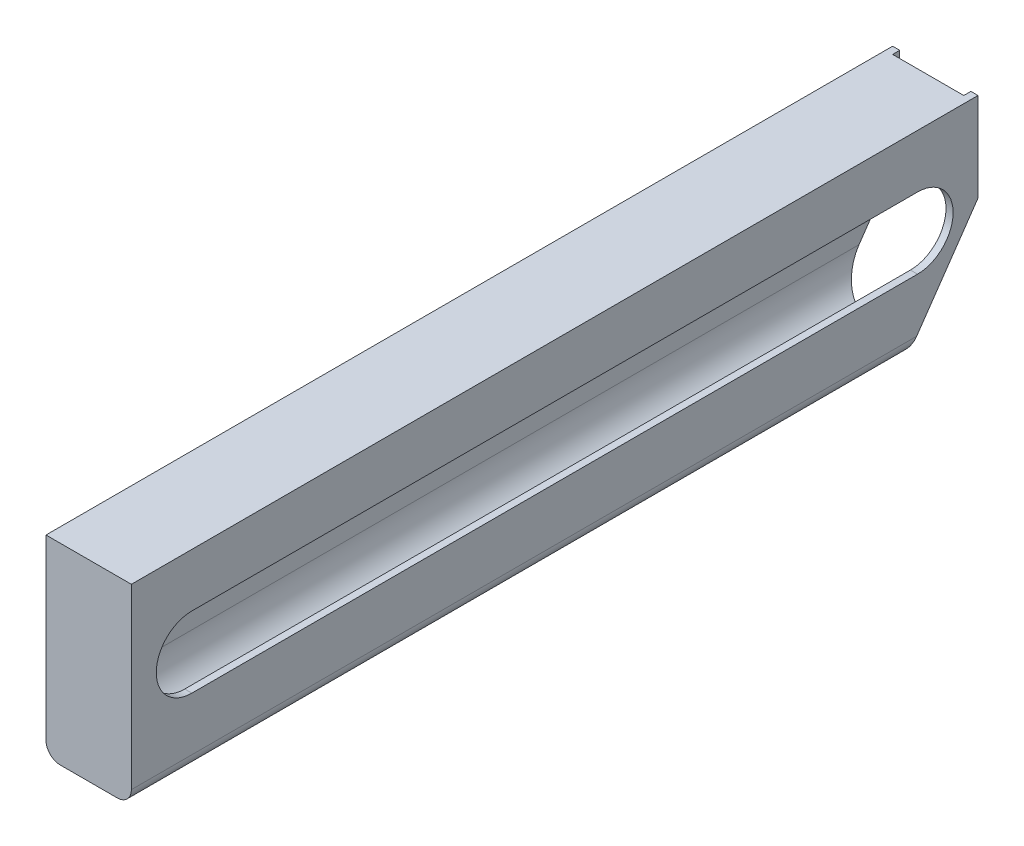
ISO-10303-21;
HEADER;
FILE_DESCRIPTION(('STEP AP214'),'2;1');
FILE_NAME('part.step','',(''),(''),'','','');
FILE_SCHEMA(('AUTOMOTIVE_DESIGN { 1 0 10303 214 1 1 1 1 }'));
ENDSEC;
DATA;
#1=APPLICATION_CONTEXT('core data for automotive mechanical design processes');
#2=APPLICATION_PROTOCOL_DEFINITION('international standard','automotive_design',2000,#1);
#3=PRODUCT_CONTEXT('',#1,'mechanical');
#4=PRODUCT('Part','Part','',(#3));
#5=PRODUCT_RELATED_PRODUCT_CATEGORY('part','',(#4));
#6=PRODUCT_DEFINITION_FORMATION('','',#4);
#7=PRODUCT_DEFINITION_CONTEXT('part definition',#1,'design');
#8=PRODUCT_DEFINITION('design','',#6,#7);
#9=PRODUCT_DEFINITION_SHAPE('','',#8);
#10=(LENGTH_UNIT() NAMED_UNIT(*) SI_UNIT(.MILLI.,.METRE.));
#11=(NAMED_UNIT(*) PLANE_ANGLE_UNIT() SI_UNIT($,.RADIAN.));
#12=(NAMED_UNIT(*) SI_UNIT($,.STERADIAN.) SOLID_ANGLE_UNIT());
#13=UNCERTAINTY_MEASURE_WITH_UNIT(LENGTH_MEASURE(1.E-05),#10,'distance_accuracy_value','');
#14=(GEOMETRIC_REPRESENTATION_CONTEXT(3) GLOBAL_UNCERTAINTY_ASSIGNED_CONTEXT((#13)) GLOBAL_UNIT_ASSIGNED_CONTEXT((#10,
#11,#12)) REPRESENTATION_CONTEXT('',''));
#15=CARTESIAN_POINT('',(0.,0.,0.));
#16=DIRECTION('',(0.,0.,1.));
#17=DIRECTION('',(1.,0.,0.));
#18=AXIS2_PLACEMENT_3D('',#15,#16,#17);
#19=CARTESIAN_POINT('',(6.4853819046404E-12,-8.3,117.));
#20=DIRECTION('',(0.,0.,-1.));
#21=DIRECTION('',(-1.,0.,0.));
#22=AXIS2_PLACEMENT_3D('',#19,#20,#21);
#23=PLANE('',#22);
#24=DIRECTION('',(0.,1.,0.));
#25=VECTOR('',#24,1.);
#26=CARTESIAN_POINT('',(-4.99999999999351,-8.3,117.));
#27=LINE('',#26,#25);
#28=CARTESIAN_POINT('',(-4.99999999999351,-8.3,117.));
#29=VERTEX_POINT('',#28);
#30=CARTESIAN_POINT('',(-4.99999999999351,11.5,117.));
#31=VERTEX_POINT('',#30);
#32=EDGE_CURVE('E318',#29,#31,#27,.T.);
#33=ORIENTED_EDGE('',*,*,#32,.T.);
#34=DIRECTION('',(1.,0.,0.));
#35=VECTOR('',#34,1.);
#36=CARTESIAN_POINT('',(5.00000000000649,11.5,117.));
#37=LINE('',#36,#35);
#38=CARTESIAN_POINT('',(5.00000000000649,11.5,117.));
#39=VERTEX_POINT('',#38);
#40=EDGE_CURVE('E321',#31,#39,#37,.T.);
#41=ORIENTED_EDGE('',*,*,#40,.T.);
#42=DIRECTION('',(0.,-1.,0.));
#43=VECTOR('',#42,1.);
#44=CARTESIAN_POINT('',(5.00000000000649,-8.3,117.));
#45=LINE('',#44,#43);
#46=CARTESIAN_POINT('',(5.00000000000649,-8.3,117.));
#47=VERTEX_POINT('',#46);
#48=EDGE_CURVE('E325',#39,#47,#45,.T.);
#49=ORIENTED_EDGE('',*,*,#48,.T.);
#50=CARTESIAN_POINT('',(6.4853819046404E-12,-8.3,117.));
#51=DIRECTION('',(0.,0.,-1.));
#52=DIRECTION('',(-1.,0.,0.));
#53=AXIS2_PLACEMENT_3D('',#50,#51,#52);
#54=CIRCLE('',#53,5.);
#55=EDGE_CURVE('E328',#47,#29,#54,.T.);
#56=ORIENTED_EDGE('',*,*,#55,.T.);
#57=EDGE_LOOP('',(#33,#41,#49,#56));
#58=FACE_BOUND('',#57,.T.);
#59=DIRECTION('',(1.,0.,0.));
#60=VECTOR('',#59,1.);
#61=CARTESIAN_POINT('',(3.,-9.75,117.));
#62=LINE('',#61,#60);
#63=CARTESIAN_POINT('',(-3.,-9.75,117.));
#64=VERTEX_POINT('',#63);
#65=CARTESIAN_POINT('',(3.,-9.75,117.));
#66=VERTEX_POINT('',#65);
#67=EDGE_CURVE('E572',#64,#66,#62,.T.);
#68=ORIENTED_EDGE('',*,*,#67,.F.);
#69=DIRECTION('',(0.,1.,0.));
#70=VECTOR('',#69,1.);
#71=CARTESIAN_POINT('',(-3.,-9.75,117.));
#72=LINE('',#71,#70);
#73=CARTESIAN_POINT('',(-3.,-12.25,117.));
#74=VERTEX_POINT('',#73);
#75=EDGE_CURVE('E227',#74,#64,#72,.T.);
#76=ORIENTED_EDGE('',*,*,#75,.F.);
#77=DIRECTION('',(-1.,0.,0.));
#78=VECTOR('',#77,1.);
#79=CARTESIAN_POINT('',(3.,-12.25,117.));
#80=LINE('',#79,#78);
#81=CARTESIAN_POINT('',(3.,-12.25,117.));
#82=VERTEX_POINT('',#81);
#83=EDGE_CURVE('E223',#82,#74,#80,.T.);
#84=ORIENTED_EDGE('',*,*,#83,.F.);
#85=DIRECTION('',(0.,-1.,0.));
#86=VECTOR('',#85,1.);
#87=CARTESIAN_POINT('',(3.,-9.75,117.));
#88=LINE('',#87,#86);
#89=EDGE_CURVE('E574',#66,#82,#88,.T.);
#90=ORIENTED_EDGE('',*,*,#89,.F.);
#91=EDGE_LOOP('',(#68,#76,#84,#90));
#92=FACE_BOUND('',#91,.T.);
#93=ADVANCED_FACE('F32',(#58,#92),#23,.T.);
#94=CARTESIAN_POINT('',(4.,-12.5,0.));
#95=DIRECTION('',(0.,0.,-1.));
#96=DIRECTION('',(-1.,0.,0.));
#97=AXIS2_PLACEMENT_3D('',#94,#95,#96);
#98=PLANE('',#97);
#99=DIRECTION('',(1.,0.,0.));
#100=VECTOR('',#99,1.);
#101=CARTESIAN_POINT('',(-6.,0.,0.));
#102=LINE('',#101,#100);
#103=CARTESIAN_POINT('',(5.00000000000649,0.,0.));
#104=VERTEX_POINT('',#103);
#105=CARTESIAN_POINT('',(6.,0.,0.));
#106=VERTEX_POINT('',#105);
#107=EDGE_CURVE('E238',#104,#106,#102,.T.);
#108=ORIENTED_EDGE('',*,*,#107,.F.);
#109=DIRECTION('',(0.,-1.,0.));
#110=VECTOR('',#109,1.);
#111=CARTESIAN_POINT('',(5.00000000000649,-8.3,0.));
#112=LINE('',#111,#110);
#113=CARTESIAN_POINT('',(5.,12.5,0.));
#114=VERTEX_POINT('',#113);
#115=EDGE_CURVE('E322',#114,#104,#112,.T.);
#116=ORIENTED_EDGE('',*,*,#115,.F.);
#117=DIRECTION('',(-1.,0.,0.));
#118=VECTOR('',#117,1.);
#119=CARTESIAN_POINT('',(-6.,12.5,0.));
#120=LINE('',#119,#118);
#121=CARTESIAN_POINT('',(6.,12.5,0.));
#122=VERTEX_POINT('',#121);
#123=EDGE_CURVE('E364',#122,#114,#120,.T.);
#124=ORIENTED_EDGE('',*,*,#123,.F.);
#125=DIRECTION('',(0.,1.,0.));
#126=VECTOR('',#125,1.);
#127=CARTESIAN_POINT('',(6.,12.5,0.));
#128=LINE('',#127,#126);
#129=EDGE_CURVE('E338',#106,#122,#128,.T.);
#130=ORIENTED_EDGE('',*,*,#129,.F.);
#131=EDGE_LOOP('',(#108,#116,#124,#130));
#132=FACE_BOUND('',#131,.T.);
#133=ADVANCED_FACE('F421',(#132),#98,.T.);
#134=CARTESIAN_POINT('',(6.,12.5,119.));
#135=DIRECTION('',(-1.,0.,0.));
#136=DIRECTION('',(0.,-1.,0.));
#137=AXIS2_PLACEMENT_3D('',#134,#135,#136);
#138=PLANE('',#137);
#139=DIRECTION('',(0.,0.,-1.));
#140=VECTOR('',#139,1.);
#141=CARTESIAN_POINT('',(6.,-4.99999999999881,8.49999783422666));
#142=LINE('',#141,#140);
#143=CARTESIAN_POINT('',(6.,-4.99999999999881,110.499997834188));
#144=VERTEX_POINT('',#143);
#145=CARTESIAN_POINT('',(6.,-4.99999999999881,8.49999783422666));
#146=VERTEX_POINT('',#145);
#147=EDGE_CURVE('E283',#144,#146,#142,.T.);
#148=ORIENTED_EDGE('',*,*,#147,.F.);
#149=CARTESIAN_POINT('',(6.,-2.17742490704609E-13,110.500002165792));
#150=DIRECTION('',(1.,0.,0.));
#151=DIRECTION('',(0.,0.,-1.));
#152=AXIS2_PLACEMENT_3D('',#149,#150,#151);
#153=CIRCLE('',#152,5.00000000000047);
#154=CARTESIAN_POINT('',(6.,5.00000000000025,110.500002165792));
#155=VERTEX_POINT('',#154);
#156=EDGE_CURVE('E266',#155,#144,#153,.T.);
#157=ORIENTED_EDGE('',*,*,#156,.F.);
#158=DIRECTION('',(0.,0.,1.));
#159=VECTOR('',#158,1.);
#160=CARTESIAN_POINT('',(6.,5.00000000000025,8.50000216579248));
#161=LINE('',#160,#159);
#162=CARTESIAN_POINT('',(6.,5.00000000000025,8.50000216579248));
#163=VERTEX_POINT('',#162);
#164=EDGE_CURVE('E272',#163,#155,#161,.T.);
#165=ORIENTED_EDGE('',*,*,#164,.F.);
#166=CARTESIAN_POINT('',(6.,-2.17742490704609E-13,8.50000216579248));
#167=DIRECTION('',(1.,0.,0.));
#168=DIRECTION('',(0.,0.,-1.));
#169=AXIS2_PLACEMENT_3D('',#166,#167,#168);
#170=CIRCLE('',#169,5.00000000000047);
#171=EDGE_CURVE('E286',#146,#163,#170,.T.);
#172=ORIENTED_EDGE('',*,*,#171,.F.);
#173=EDGE_LOOP('',(#148,#157,#165,#172));
#174=FACE_BOUND('',#173,.T.);
#175=DIRECTION('',(0.,0.,-1.));
#176=VECTOR('',#175,1.);
#177=CARTESIAN_POINT('',(6.,-12.5,119.));
#178=LINE('',#177,#176);
#179=CARTESIAN_POINT('',(6.,-12.5,119.));
#180=VERTEX_POINT('',#179);
#181=CARTESIAN_POINT('',(6.,-12.5,8.62068965517241));
#182=VERTEX_POINT('',#181);
#183=EDGE_CURVE('E361',#180,#182,#178,.T.);
#184=ORIENTED_EDGE('',*,*,#183,.T.);
#185=DIRECTION('',(0.,-0.823212785915306,0.56773295580366));
#186=VECTOR('',#185,1.);
#187=CARTESIAN_POINT('',(6.,0.,0.));
#188=LINE('',#187,#186);
#189=EDGE_CURVE('E229',#106,#182,#188,.T.);
#190=ORIENTED_EDGE('',*,*,#189,.F.);
#191=ORIENTED_EDGE('',*,*,#129,.T.);
#192=DIRECTION('',(0.,0.,-1.));
#193=VECTOR('',#192,1.);
#194=CARTESIAN_POINT('',(6.,12.5,119.));
#195=LINE('',#194,#193);
#196=CARTESIAN_POINT('',(6.,12.5,119.));
#197=VERTEX_POINT('',#196);
#198=EDGE_CURVE('E383',#197,#122,#195,.T.);
#199=ORIENTED_EDGE('',*,*,#198,.F.);
#200=DIRECTION('',(0.,1.,0.));
#201=VECTOR('',#200,1.);
#202=CARTESIAN_POINT('',(6.,12.5,119.));
#203=LINE('',#202,#201);
#204=EDGE_CURVE('E347',#180,#197,#203,.T.);
#205=ORIENTED_EDGE('',*,*,#204,.F.);
#206=EDGE_LOOP('',(#184,#190,#191,#199,#205));
#207=FACE_BOUND('',#206,.T.);
#208=ADVANCED_FACE('F34',(#174,#207),#138,.F.);
#209=CARTESIAN_POINT('',(-6.,12.5,119.));
#210=DIRECTION('',(0.,-1.,0.));
#211=DIRECTION('',(1.,0.,0.));
#212=AXIS2_PLACEMENT_3D('',#209,#210,#211);
#213=PLANE('',#212);
#214=ORIENTED_EDGE('',*,*,#123,.T.);
#215=DIRECTION('',(0.,0.,-1.));
#216=VECTOR('',#215,1.);
#217=CARTESIAN_POINT('',(5.,12.5,-1.));
#218=LINE('',#217,#216);
#219=CARTESIAN_POINT('',(5.,12.5,1.));
#220=VERTEX_POINT('',#219);
#221=EDGE_CURVE('E254',#220,#114,#218,.T.);
#222=ORIENTED_EDGE('',*,*,#221,.F.);
#223=DIRECTION('',(1.,0.,0.));
#224=VECTOR('',#223,1.);
#225=CARTESIAN_POINT('',(-5.,12.5,1.));
#226=LINE('',#225,#224);
#227=CARTESIAN_POINT('',(-5.,12.5,1.));
#228=VERTEX_POINT('',#227);
#229=EDGE_CURVE('E260',#228,#220,#226,.T.);
#230=ORIENTED_EDGE('',*,*,#229,.F.);
#231=DIRECTION('',(0.,0.,1.));
#232=VECTOR('',#231,1.);
#233=CARTESIAN_POINT('',(-5.,12.5,-1.));
#234=LINE('',#233,#232);
#235=CARTESIAN_POINT('',(-5.,12.5,0.));
#236=VERTEX_POINT('',#235);
#237=EDGE_CURVE('E257',#236,#228,#234,.T.);
#238=ORIENTED_EDGE('',*,*,#237,.F.);
#239=CARTESIAN_POINT('',(-6.,12.5,0.));
#240=VERTEX_POINT('',#239);
#241=EDGE_CURVE('E363',#236,#240,#120,.T.);
#242=ORIENTED_EDGE('',*,*,#241,.T.);
#243=DIRECTION('',(0.,0.,-1.));
#244=VECTOR('',#243,1.);
#245=CARTESIAN_POINT('',(-6.,12.5,119.));
#246=LINE('',#245,#244);
#247=CARTESIAN_POINT('',(-6.,12.5,119.));
#248=VERTEX_POINT('',#247);
#249=EDGE_CURVE('E380',#248,#240,#246,.T.);
#250=ORIENTED_EDGE('',*,*,#249,.F.);
#251=DIRECTION('',(-1.,0.,0.));
#252=VECTOR('',#251,1.);
#253=CARTESIAN_POINT('',(-6.,12.5,119.));
#254=LINE('',#253,#252);
#255=EDGE_CURVE('E350',#197,#248,#254,.T.);
#256=ORIENTED_EDGE('',*,*,#255,.F.);
#257=ORIENTED_EDGE('',*,*,#198,.T.);
#258=EDGE_LOOP('',(#214,#222,#230,#238,#242,#250,#256,#257));
#259=FACE_BOUND('',#258,.T.);
#260=ADVANCED_FACE('F417',(#259),#213,.F.);
#261=CARTESIAN_POINT('',(-6.,-12.5,119.));
#262=DIRECTION('',(1.,0.,0.));
#263=DIRECTION('',(0.,0.,-1.));
#264=AXIS2_PLACEMENT_3D('',#261,#262,#263);
#265=PLANE('',#264);
#266=DIRECTION('',(0.,0.,1.));
#267=VECTOR('',#266,1.);
#268=CARTESIAN_POINT('',(-6.,5.00000000000025,8.50000216579248));
#269=LINE('',#268,#267);
#270=CARTESIAN_POINT('',(-6.,5.00000000000025,8.50000216579248));
#271=VERTEX_POINT('',#270);
#272=CARTESIAN_POINT('',(-6.,5.00000000000025,110.500002165792));
#273=VERTEX_POINT('',#272);
#274=EDGE_CURVE('E278',#271,#273,#269,.T.);
#275=ORIENTED_EDGE('',*,*,#274,.T.);
#276=CARTESIAN_POINT('',(-6.,-2.17742490704609E-13,110.500002165792));
#277=DIRECTION('',(1.,0.,0.));
#278=DIRECTION('',(0.,0.,-1.));
#279=AXIS2_PLACEMENT_3D('',#276,#277,#278);
#280=CIRCLE('',#279,5.00000000000047);
#281=CARTESIAN_POINT('',(-6.,-4.99999999999881,110.499997834188));
#282=VERTEX_POINT('',#281);
#283=EDGE_CURVE('E268',#273,#282,#280,.T.);
#284=ORIENTED_EDGE('',*,*,#283,.T.);
#285=DIRECTION('',(0.,0.,-1.));
#286=VECTOR('',#285,1.);
#287=CARTESIAN_POINT('',(-6.,-4.99999999999881,8.49999783422666));
#288=LINE('',#287,#286);
#289=CARTESIAN_POINT('',(-6.,-4.99999999999881,8.49999783422667));
#290=VERTEX_POINT('',#289);
#291=EDGE_CURVE('E271',#282,#290,#288,.T.);
#292=ORIENTED_EDGE('',*,*,#291,.T.);
#293=CARTESIAN_POINT('',(-6.,-2.17742490704609E-13,8.50000216579248));
#294=DIRECTION('',(1.,0.,0.));
#295=DIRECTION('',(0.,0.,-1.));
#296=AXIS2_PLACEMENT_3D('',#293,#294,#295);
#297=CIRCLE('',#296,5.00000000000047);
#298=EDGE_CURVE('E275',#290,#271,#297,.T.);
#299=ORIENTED_EDGE('',*,*,#298,.T.);
#300=EDGE_LOOP('',(#275,#284,#292,#299));
#301=FACE_BOUND('',#300,.T.);
#302=DIRECTION('',(0.,-1.,0.));
#303=VECTOR('',#302,1.);
#304=CARTESIAN_POINT('',(-6.,-12.5,0.));
#305=LINE('',#304,#303);
#306=CARTESIAN_POINT('',(-6.,0.,0.));
#307=VERTEX_POINT('',#306);
#308=EDGE_CURVE('E351',#240,#307,#305,.T.);
#309=ORIENTED_EDGE('',*,*,#308,.T.);
#310=DIRECTION('',(0.,-0.823212785915306,0.56773295580366));
#311=VECTOR('',#310,1.);
#312=CARTESIAN_POINT('',(-6.,0.,0.));
#313=LINE('',#312,#311);
#314=CARTESIAN_POINT('',(-6.,-12.5,8.62068965517241));
#315=VERTEX_POINT('',#314);
#316=EDGE_CURVE('E231',#307,#315,#313,.T.);
#317=ORIENTED_EDGE('',*,*,#316,.T.);
#318=DIRECTION('',(0.,0.,-1.));
#319=VECTOR('',#318,1.);
#320=CARTESIAN_POINT('',(-6.,-12.5,119.));
#321=LINE('',#320,#319);
#322=CARTESIAN_POINT('',(-6.,-12.5,119.));
#323=VERTEX_POINT('',#322);
#324=EDGE_CURVE('E377',#323,#315,#321,.T.);
#325=ORIENTED_EDGE('',*,*,#324,.F.);
#326=DIRECTION('',(0.,-1.,0.));
#327=VECTOR('',#326,1.);
#328=CARTESIAN_POINT('',(-6.,-12.5,119.));
#329=LINE('',#328,#327);
#330=EDGE_CURVE('E353',#248,#323,#329,.T.);
#331=ORIENTED_EDGE('',*,*,#330,.F.);
#332=ORIENTED_EDGE('',*,*,#249,.T.);
#333=EDGE_LOOP('',(#309,#317,#325,#331,#332));
#334=FACE_BOUND('',#333,.T.);
#335=ADVANCED_FACE('F443',(#301,#334),#265,.F.);
#336=CARTESIAN_POINT('',(-4.,-12.5,119.));
#337=DIRECTION('',(0.,0.,-1.));
#338=DIRECTION('',(-1.,0.,0.));
#339=AXIS2_PLACEMENT_3D('',#336,#337,#338);
#340=CYLINDRICAL_SURFACE('',#339,2.);
#341=ORIENTED_EDGE('',*,*,#324,.T.);
#342=CARTESIAN_POINT('',(-4.,-12.5,8.6206896551724));
#343=DIRECTION('',(0.,0.56773295580366,0.823212785915306));
#344=DIRECTION('',(0.,0.823212785915306,-0.56773295580366));
#345=AXIS2_PLACEMENT_3D('',#342,#343,#344);
#346=ELLIPSE('',#345,2.42950551087014,2.);
#347=CARTESIAN_POINT('',(-4.,-14.5,10.));
#348=VERTEX_POINT('',#347);
#349=EDGE_CURVE('E251',#315,#348,#346,.T.);
#350=ORIENTED_EDGE('',*,*,#349,.T.);
#351=DIRECTION('',(0.,0.,-1.));
#352=VECTOR('',#351,1.);
#353=CARTESIAN_POINT('',(-4.,-14.5,119.));
#354=LINE('',#353,#352);
#355=CARTESIAN_POINT('',(-4.,-14.5,119.));
#356=VERTEX_POINT('',#355);
#357=EDGE_CURVE('E374',#356,#348,#354,.T.);
#358=ORIENTED_EDGE('',*,*,#357,.F.);
#359=CARTESIAN_POINT('',(-4.,-12.5,119.));
#360=DIRECTION('',(0.,0.,1.));
#361=DIRECTION('',(-1.,0.,0.));
#362=AXIS2_PLACEMENT_3D('',#359,#360,#361);
#363=CIRCLE('',#362,2.);
#364=EDGE_CURVE('E355',#323,#356,#363,.T.);
#365=ORIENTED_EDGE('',*,*,#364,.F.);
#366=EDGE_LOOP('',(#341,#350,#358,#365));
#367=FACE_BOUND('',#366,.T.);
#368=ADVANCED_FACE('F439',(#367),#340,.T.);
#369=CARTESIAN_POINT('',(4.,-14.5,119.));
#370=DIRECTION('',(0.,1.,0.));
#371=DIRECTION('',(-1.,0.,0.));
#372=AXIS2_PLACEMENT_3D('',#369,#370,#371);
#373=PLANE('',#372);
#374=ORIENTED_EDGE('',*,*,#357,.T.);
#375=DIRECTION('',(1.,0.,0.));
#376=VECTOR('',#375,1.);
#377=CARTESIAN_POINT('',(-6.,-14.5,10.));
#378=LINE('',#377,#376);
#379=CARTESIAN_POINT('',(4.,-14.5,9.99999999999999));
#380=VERTEX_POINT('',#379);
#381=EDGE_CURVE('E239',#348,#380,#378,.T.);
#382=ORIENTED_EDGE('',*,*,#381,.T.);
#383=DIRECTION('',(0.,0.,-1.));
#384=VECTOR('',#383,1.);
#385=CARTESIAN_POINT('',(4.,-14.5,119.));
#386=LINE('',#385,#384);
#387=CARTESIAN_POINT('',(4.,-14.5,119.));
#388=VERTEX_POINT('',#387);
#389=EDGE_CURVE('E371',#388,#380,#386,.T.);
#390=ORIENTED_EDGE('',*,*,#389,.F.);
#391=DIRECTION('',(1.,0.,0.));
#392=VECTOR('',#391,1.);
#393=CARTESIAN_POINT('',(4.,-14.5,119.));
#394=LINE('',#393,#392);
#395=EDGE_CURVE('E357',#356,#388,#394,.T.);
#396=ORIENTED_EDGE('',*,*,#395,.F.);
#397=EDGE_LOOP('',(#374,#382,#390,#396));
#398=FACE_BOUND('',#397,.T.);
#399=ADVANCED_FACE('F434',(#398),#373,.F.);
#400=CARTESIAN_POINT('',(4.,-12.5,119.));
#401=DIRECTION('',(0.,0.,-1.));
#402=DIRECTION('',(-1.,0.,0.));
#403=AXIS2_PLACEMENT_3D('',#400,#401,#402);
#404=CYLINDRICAL_SURFACE('',#403,2.);
#405=ORIENTED_EDGE('',*,*,#389,.T.);
#406=CARTESIAN_POINT('',(4.,-12.5,8.6206896551724));
#407=DIRECTION('',(0.,0.56773295580366,0.823212785915306));
#408=DIRECTION('',(0.,0.823212785915306,-0.56773295580366));
#409=AXIS2_PLACEMENT_3D('',#406,#407,#408);
#410=ELLIPSE('',#409,2.42950551087014,2.);
#411=EDGE_CURVE('E248',#380,#182,#410,.T.);
#412=ORIENTED_EDGE('',*,*,#411,.T.);
#413=ORIENTED_EDGE('',*,*,#183,.F.);
#414=CARTESIAN_POINT('',(4.,-12.5,119.));
#415=DIRECTION('',(0.,0.,1.));
#416=DIRECTION('',(-1.,0.,0.));
#417=AXIS2_PLACEMENT_3D('',#414,#415,#416);
#418=CIRCLE('',#417,2.);
#419=EDGE_CURVE('E359',#388,#180,#418,.T.);
#420=ORIENTED_EDGE('',*,*,#419,.F.);
#421=EDGE_LOOP('',(#405,#412,#413,#420));
#422=FACE_BOUND('',#421,.T.);
#423=ADVANCED_FACE('F431',(#422),#404,.T.);
#424=CARTESIAN_POINT('',(4.,-12.5,119.));
#425=DIRECTION('',(0.,0.,-1.));
#426=DIRECTION('',(-1.,0.,0.));
#427=AXIS2_PLACEMENT_3D('',#424,#425,#426);
#428=PLANE('',#427);
#429=ORIENTED_EDGE('',*,*,#204,.T.);
#430=ORIENTED_EDGE('',*,*,#255,.T.);
#431=ORIENTED_EDGE('',*,*,#330,.T.);
#432=ORIENTED_EDGE('',*,*,#364,.T.);
#433=ORIENTED_EDGE('',*,*,#395,.T.);
#434=ORIENTED_EDGE('',*,*,#419,.T.);
#435=EDGE_LOOP('',(#429,#430,#431,#432,#433,#434));
#436=FACE_BOUND('',#435,.T.);
#437=ADVANCED_FACE('F452',(#436),#428,.F.);
#438=CARTESIAN_POINT('',(-4.99999999999351,0.,0.));
#439=VERTEX_POINT('',#438);
#440=EDGE_CURVE('E242',#307,#439,#102,.T.);
#441=ORIENTED_EDGE('',*,*,#440,.F.);
#442=ORIENTED_EDGE('',*,*,#308,.F.);
#443=ORIENTED_EDGE('',*,*,#241,.F.);
#444=DIRECTION('',(0.,1.,0.));
#445=VECTOR('',#444,1.);
#446=CARTESIAN_POINT('',(-4.99999999999351,-8.3,0.));
#447=LINE('',#446,#445);
#448=EDGE_CURVE('E317',#439,#236,#447,.T.);
#449=ORIENTED_EDGE('',*,*,#448,.F.);
#450=EDGE_LOOP('',(#441,#442,#443,#449));
#451=FACE_BOUND('',#450,.T.);
#452=ADVANCED_FACE('F449',(#451),#98,.T.);
#453=CARTESIAN_POINT('',(-4.99999999999351,-8.3,117.));
#454=DIRECTION('',(-1.,0.,0.));
#455=DIRECTION('',(0.,-1.,0.));
#456=AXIS2_PLACEMENT_3D('',#453,#454,#455);
#457=PLANE('',#456);
#458=DIRECTION('',(0.,0.,1.));
#459=VECTOR('',#458,1.);
#460=CARTESIAN_POINT('',(-4.99999999999351,-4.99999999999881,117.));
#461=LINE('',#460,#459);
#462=CARTESIAN_POINT('',(-4.99999999999351,-4.99999999999881,8.49999783422666));
#463=VERTEX_POINT('',#462);
#464=CARTESIAN_POINT('',(-4.99999999999351,-4.99999999999881,110.499997834188));
#465=VERTEX_POINT('',#464);
#466=EDGE_CURVE('E294',#463,#465,#461,.T.);
#467=ORIENTED_EDGE('',*,*,#466,.T.);
#468=CARTESIAN_POINT('',(-4.99999999999351,-2.17742490704609E-13,110.500002165792));
#469=DIRECTION('',(-1.,0.,0.));
#470=DIRECTION('',(0.,-1.,0.));
#471=AXIS2_PLACEMENT_3D('',#468,#469,#470);
#472=CIRCLE('',#471,5.00000000000047);
#473=CARTESIAN_POINT('',(-4.99999999999351,5.00000000000025,110.500002165792));
#474=VERTEX_POINT('',#473);
#475=EDGE_CURVE('E314',#465,#474,#472,.T.);
#476=ORIENTED_EDGE('',*,*,#475,.T.);
#477=DIRECTION('',(0.,0.,-1.));
#478=VECTOR('',#477,1.);
#479=CARTESIAN_POINT('',(-4.99999999999351,5.00000000000025,117.));
#480=LINE('',#479,#478);
#481=CARTESIAN_POINT('',(-4.99999999999351,5.00000000000025,8.50000216579248));
#482=VERTEX_POINT('',#481);
#483=EDGE_CURVE('E311',#474,#482,#480,.T.);
#484=ORIENTED_EDGE('',*,*,#483,.T.);
#485=CARTESIAN_POINT('',(-4.99999999999351,-2.17742490704609E-13,8.50000216579248));
#486=DIRECTION('',(-1.,0.,0.));
#487=DIRECTION('',(0.,-1.,0.));
#488=AXIS2_PLACEMENT_3D('',#485,#486,#487);
#489=CIRCLE('',#488,5.00000000000047);
#490=EDGE_CURVE('E308',#482,#463,#489,.T.);
#491=ORIENTED_EDGE('',*,*,#490,.T.);
#492=EDGE_LOOP('',(#467,#476,#484,#491));
#493=FACE_BOUND('',#492,.T.);
#494=DIRECTION('',(0.,0.,-1.));
#495=VECTOR('',#494,1.);
#496=CARTESIAN_POINT('',(-4.99999999999351,-8.3,117.));
#497=LINE('',#496,#495);
#498=CARTESIAN_POINT('',(-4.99999999999351,-8.3,5.72413793103449));
#499=VERTEX_POINT('',#498);
#500=EDGE_CURVE('E335',#29,#499,#497,.T.);
#501=ORIENTED_EDGE('',*,*,#500,.T.);
#502=DIRECTION('',(0.,0.823212785915306,-0.56773295580366));
#503=VECTOR('',#502,1.);
#504=CARTESIAN_POINT('',(-4.99999999999352,-60.3064464141821,41.5906526994359));
#505=LINE('',#504,#503);
#506=EDGE_CURVE('E245',#499,#439,#505,.T.);
#507=ORIENTED_EDGE('',*,*,#506,.T.);
#508=ORIENTED_EDGE('',*,*,#448,.T.);
#509=ORIENTED_EDGE('',*,*,#237,.T.);
#510=DIRECTION('',(0.,1.,0.));
#511=VECTOR('',#510,1.);
#512=CARTESIAN_POINT('',(-5.,-14.5,1.));
#513=LINE('',#512,#511);
#514=CARTESIAN_POINT('',(-4.99999999999351,11.5,1.));
#515=VERTEX_POINT('',#514);
#516=EDGE_CURVE('E263',#515,#228,#513,.T.);
#517=ORIENTED_EDGE('',*,*,#516,.F.);
#518=DIRECTION('',(0.,0.,-1.));
#519=VECTOR('',#518,1.);
#520=CARTESIAN_POINT('',(-4.99999999999351,11.5,117.));
#521=LINE('',#520,#519);
#522=EDGE_CURVE('E331',#31,#515,#521,.T.);
#523=ORIENTED_EDGE('',*,*,#522,.F.);
#524=ORIENTED_EDGE('',*,*,#32,.F.);
#525=EDGE_LOOP('',(#501,#507,#508,#509,#517,#523,#524));
#526=FACE_BOUND('',#525,.T.);
#527=ADVANCED_FACE('F411',(#493,#526),#457,.F.);
#528=CARTESIAN_POINT('',(6.4853819046404E-12,-8.3,117.));
#529=DIRECTION('',(0.,0.,-1.));
#530=DIRECTION('',(-1.,0.,0.));
#531=AXIS2_PLACEMENT_3D('',#528,#529,#530);
#532=CYLINDRICAL_SURFACE('',#531,5.);
#533=DIRECTION('',(0.,0.,-1.));
#534=VECTOR('',#533,1.);
#535=CARTESIAN_POINT('',(5.00000000000649,-8.3,117.));
#536=LINE('',#535,#534);
#537=CARTESIAN_POINT('',(5.00000000000649,-8.3,5.72413793103448));
#538=VERTEX_POINT('',#537);
#539=EDGE_CURVE('E339',#47,#538,#536,.T.);
#540=ORIENTED_EDGE('',*,*,#539,.T.);
#541=CARTESIAN_POINT('',(6.4853819046404E-12,-8.3,5.72413793103449));
#542=DIRECTION('',(0.,0.56773295580366,0.823212785915306));
#543=DIRECTION('',(0.,0.823212785915306,-0.56773295580366));
#544=AXIS2_PLACEMENT_3D('',#541,#542,#543);
#545=ELLIPSE('',#544,6.07376377717536,5.);
#546=EDGE_CURVE('E55',#538,#499,#545,.F.);
#547=ORIENTED_EDGE('',*,*,#546,.T.);
#548=ORIENTED_EDGE('',*,*,#500,.F.);
#549=ORIENTED_EDGE('',*,*,#55,.F.);
#550=EDGE_LOOP('',(#540,#547,#548,#549));
#551=FACE_BOUND('',#550,.T.);
#552=ADVANCED_FACE('F471',(#551),#532,.F.);
#553=CARTESIAN_POINT('',(5.00000000000649,-8.3,117.));
#554=DIRECTION('',(1.,0.,0.));
#555=DIRECTION('',(0.,1.,0.));
#556=AXIS2_PLACEMENT_3D('',#553,#554,#555);
#557=PLANE('',#556);
#558=DIRECTION('',(0.,0.,1.));
#559=VECTOR('',#558,1.);
#560=CARTESIAN_POINT('',(5.00000000000649,5.00000000000025,117.));
#561=LINE('',#560,#559);
#562=CARTESIAN_POINT('',(5.00000000000649,5.00000000000025,8.50000216579248));
#563=VERTEX_POINT('',#562);
#564=CARTESIAN_POINT('',(5.00000000000649,5.00000000000025,110.500002165792));
#565=VERTEX_POINT('',#564);
#566=EDGE_CURVE('E392',#563,#565,#561,.T.);
#567=ORIENTED_EDGE('',*,*,#566,.T.);
#568=CARTESIAN_POINT('',(5.00000000000649,-2.17742490704609E-13,110.500002165792));
#569=DIRECTION('',(1.,0.,0.));
#570=DIRECTION('',(0.,1.,0.));
#571=AXIS2_PLACEMENT_3D('',#568,#569,#570);
#572=CIRCLE('',#571,5.00000000000047);
#573=CARTESIAN_POINT('',(5.00000000000649,-4.99999999999881,110.499997834188));
#574=VERTEX_POINT('',#573);
#575=EDGE_CURVE('E395',#565,#574,#572,.T.);
#576=ORIENTED_EDGE('',*,*,#575,.T.);
#577=DIRECTION('',(0.,0.,-1.));
#578=VECTOR('',#577,1.);
#579=CARTESIAN_POINT('',(5.00000000000649,-4.99999999999881,117.));
#580=LINE('',#579,#578);
#581=CARTESIAN_POINT('',(5.00000000000649,-4.99999999999881,8.49999783422667));
#582=VERTEX_POINT('',#581);
#583=EDGE_CURVE('E386',#574,#582,#580,.T.);
#584=ORIENTED_EDGE('',*,*,#583,.T.);
#585=CARTESIAN_POINT('',(5.00000000000649,-2.17742490704609E-13,8.50000216579248));
#586=DIRECTION('',(1.,0.,0.));
#587=DIRECTION('',(0.,1.,0.));
#588=AXIS2_PLACEMENT_3D('',#585,#586,#587);
#589=CIRCLE('',#588,5.00000000000047);
#590=EDGE_CURVE('E389',#582,#563,#589,.T.);
#591=ORIENTED_EDGE('',*,*,#590,.T.);
#592=EDGE_LOOP('',(#567,#576,#584,#591));
#593=FACE_BOUND('',#592,.T.);
#594=ORIENTED_EDGE('',*,*,#115,.T.);
#595=DIRECTION('',(0.,-0.823212785915306,0.56773295580366));
#596=VECTOR('',#595,1.);
#597=CARTESIAN_POINT('',(5.00000000000648,-60.3064464141821,41.5906526994359));
#598=LINE('',#597,#596);
#599=EDGE_CURVE('E11',#104,#538,#598,.T.);
#600=ORIENTED_EDGE('',*,*,#599,.T.);
#601=ORIENTED_EDGE('',*,*,#539,.F.);
#602=ORIENTED_EDGE('',*,*,#48,.F.);
#603=DIRECTION('',(0.,0.,-1.));
#604=VECTOR('',#603,1.);
#605=CARTESIAN_POINT('',(5.00000000000649,11.5,117.));
#606=LINE('',#605,#604);
#607=CARTESIAN_POINT('',(5.,11.5,1.));
#608=VERTEX_POINT('',#607);
#609=EDGE_CURVE('E342',#39,#608,#606,.T.);
#610=ORIENTED_EDGE('',*,*,#609,.T.);
#611=DIRECTION('',(0.,1.,0.));
#612=VECTOR('',#611,1.);
#613=CARTESIAN_POINT('',(5.,-14.5,1.));
#614=LINE('',#613,#612);
#615=EDGE_CURVE('E264',#608,#220,#614,.T.);
#616=ORIENTED_EDGE('',*,*,#615,.T.);
#617=ORIENTED_EDGE('',*,*,#221,.T.);
#618=EDGE_LOOP('',(#594,#600,#601,#602,#610,#616,#617));
#619=FACE_BOUND('',#618,.T.);
#620=ADVANCED_FACE('F405',(#593,#619),#557,.F.);
#621=CARTESIAN_POINT('',(5.00000000000649,11.5,117.));
#622=DIRECTION('',(0.,1.,0.));
#623=DIRECTION('',(-1.,0.,0.));
#624=AXIS2_PLACEMENT_3D('',#621,#622,#623);
#625=PLANE('',#624);
#626=ORIENTED_EDGE('',*,*,#522,.T.);
#627=DIRECTION('',(1.,0.,0.));
#628=VECTOR('',#627,1.);
#629=CARTESIAN_POINT('',(5.00000000000649,11.5,1.));
#630=LINE('',#629,#628);
#631=EDGE_CURVE('E40',#515,#608,#630,.T.);
#632=ORIENTED_EDGE('',*,*,#631,.T.);
#633=ORIENTED_EDGE('',*,*,#609,.F.);
#634=ORIENTED_EDGE('',*,*,#40,.F.);
#635=EDGE_LOOP('',(#626,#632,#633,#634));
#636=FACE_BOUND('',#635,.T.);
#637=ADVANCED_FACE('F400',(#636),#625,.F.);
#638=CARTESIAN_POINT('',(-6.,-4.99999999999881,8.49999783422666));
#639=DIRECTION('',(0.,-1.,0.));
#640=DIRECTION('',(0.,0.,-1.));
#641=AXIS2_PLACEMENT_3D('',#638,#639,#640);
#642=PLANE('',#641);
#643=DIRECTION('',(1.,0.,0.));
#644=VECTOR('',#643,1.);
#645=CARTESIAN_POINT('',(-6.,-4.99999999999881,110.499997834188));
#646=LINE('',#645,#644);
#647=EDGE_CURVE('E281',#574,#144,#646,.T.);
#648=ORIENTED_EDGE('',*,*,#647,.T.);
#649=ORIENTED_EDGE('',*,*,#147,.T.);
#650=DIRECTION('',(1.,0.,0.));
#651=VECTOR('',#650,1.);
#652=CARTESIAN_POINT('',(-6.,-4.99999999999881,8.49999783422666));
#653=LINE('',#652,#651);
#654=EDGE_CURVE('E303',#582,#146,#653,.T.);
#655=ORIENTED_EDGE('',*,*,#654,.F.);
#656=ORIENTED_EDGE('',*,*,#583,.F.);
#657=EDGE_LOOP('',(#648,#649,#655,#656));
#658=FACE_BOUND('',#657,.T.);
#659=ADVANCED_FACE('F479',(#658),#642,.F.);
#660=CARTESIAN_POINT('',(-6.,-2.17742490704609E-13,8.50000216579248));
#661=DIRECTION('',(1.,0.,0.));
#662=DIRECTION('',(0.,0.,-1.));
#663=AXIS2_PLACEMENT_3D('',#660,#661,#662);
#664=CYLINDRICAL_SURFACE('',#663,5.00000000000047);
#665=ORIENTED_EDGE('',*,*,#654,.T.);
#666=ORIENTED_EDGE('',*,*,#171,.T.);
#667=DIRECTION('',(1.,0.,0.));
#668=VECTOR('',#667,1.);
#669=CARTESIAN_POINT('',(-6.,5.00000000000025,8.50000216579248));
#670=LINE('',#669,#668);
#671=EDGE_CURVE('E299',#563,#163,#670,.T.);
#672=ORIENTED_EDGE('',*,*,#671,.F.);
#673=ORIENTED_EDGE('',*,*,#590,.F.);
#674=EDGE_LOOP('',(#665,#666,#672,#673));
#675=FACE_BOUND('',#674,.T.);
#676=ADVANCED_FACE('F505',(#675),#664,.F.);
#677=CARTESIAN_POINT('',(-6.,5.00000000000025,8.50000216579248));
#678=DIRECTION('',(0.,1.,0.));
#679=DIRECTION('',(0.,0.,1.));
#680=AXIS2_PLACEMENT_3D('',#677,#678,#679);
#681=PLANE('',#680);
#682=ORIENTED_EDGE('',*,*,#671,.T.);
#683=ORIENTED_EDGE('',*,*,#164,.T.);
#684=DIRECTION('',(1.,0.,0.));
#685=VECTOR('',#684,1.);
#686=CARTESIAN_POINT('',(-6.,5.00000000000025,110.500002165792));
#687=LINE('',#686,#685);
#688=EDGE_CURVE('E295',#565,#155,#687,.T.);
#689=ORIENTED_EDGE('',*,*,#688,.F.);
#690=ORIENTED_EDGE('',*,*,#566,.F.);
#691=EDGE_LOOP('',(#682,#683,#689,#690));
#692=FACE_BOUND('',#691,.T.);
#693=ADVANCED_FACE('F499',(#692),#681,.F.);
#694=CARTESIAN_POINT('',(-6.,-2.17742490704609E-13,110.500002165792));
#695=DIRECTION('',(1.,0.,0.));
#696=DIRECTION('',(0.,0.,-1.));
#697=AXIS2_PLACEMENT_3D('',#694,#695,#696);
#698=CYLINDRICAL_SURFACE('',#697,5.00000000000047);
#699=ORIENTED_EDGE('',*,*,#688,.T.);
#700=ORIENTED_EDGE('',*,*,#156,.T.);
#701=ORIENTED_EDGE('',*,*,#647,.F.);
#702=ORIENTED_EDGE('',*,*,#575,.F.);
#703=EDGE_LOOP('',(#699,#700,#701,#702));
#704=FACE_BOUND('',#703,.T.);
#705=ADVANCED_FACE('F506',(#704),#698,.F.);
#706=EDGE_CURVE('E304',#282,#465,#646,.T.);
#707=ORIENTED_EDGE('',*,*,#706,.F.);
#708=ORIENTED_EDGE('',*,*,#283,.F.);
#709=EDGE_CURVE('E291',#273,#474,#687,.T.);
#710=ORIENTED_EDGE('',*,*,#709,.T.);
#711=ORIENTED_EDGE('',*,*,#475,.F.);
#712=EDGE_LOOP('',(#707,#708,#710,#711));
#713=FACE_BOUND('',#712,.T.);
#714=ADVANCED_FACE('F469',(#713),#698,.F.);
#715=ORIENTED_EDGE('',*,*,#709,.F.);
#716=ORIENTED_EDGE('',*,*,#274,.F.);
#717=EDGE_CURVE('E296',#271,#482,#670,.T.);
#718=ORIENTED_EDGE('',*,*,#717,.T.);
#719=ORIENTED_EDGE('',*,*,#483,.F.);
#720=EDGE_LOOP('',(#715,#716,#718,#719));
#721=FACE_BOUND('',#720,.T.);
#722=ADVANCED_FACE('F496',(#721),#681,.F.);
#723=ORIENTED_EDGE('',*,*,#717,.F.);
#724=ORIENTED_EDGE('',*,*,#298,.F.);
#725=EDGE_CURVE('E300',#290,#463,#653,.T.);
#726=ORIENTED_EDGE('',*,*,#725,.T.);
#727=ORIENTED_EDGE('',*,*,#490,.F.);
#728=EDGE_LOOP('',(#723,#724,#726,#727));
#729=FACE_BOUND('',#728,.T.);
#730=ADVANCED_FACE('F490',(#729),#664,.F.);
#731=ORIENTED_EDGE('',*,*,#725,.F.);
#732=ORIENTED_EDGE('',*,*,#291,.F.);
#733=ORIENTED_EDGE('',*,*,#706,.T.);
#734=ORIENTED_EDGE('',*,*,#466,.F.);
#735=EDGE_LOOP('',(#731,#732,#733,#734));
#736=FACE_BOUND('',#735,.T.);
#737=ADVANCED_FACE('F487',(#736),#642,.F.);
#738=CARTESIAN_POINT('',(-5.,-14.5,1.));
#739=DIRECTION('',(0.,0.,1.));
#740=DIRECTION('',(1.,0.,0.));
#741=AXIS2_PLACEMENT_3D('',#738,#739,#740);
#742=PLANE('',#741);
#743=ORIENTED_EDGE('',*,*,#516,.T.);
#744=ORIENTED_EDGE('',*,*,#229,.T.);
#745=ORIENTED_EDGE('',*,*,#615,.F.);
#746=ORIENTED_EDGE('',*,*,#631,.F.);
#747=EDGE_LOOP('',(#743,#744,#745,#746));
#748=FACE_BOUND('',#747,.T.);
#749=ADVANCED_FACE('F414',(#748),#742,.F.);
#750=CARTESIAN_POINT('',(-6.,0.,0.));
#751=DIRECTION('',(0.,0.56773295580366,0.823212785915306));
#752=DIRECTION('',(0.,-0.823212785915306,0.56773295580366));
#753=AXIS2_PLACEMENT_3D('',#750,#751,#752);
#754=PLANE('',#753);
#755=ORIENTED_EDGE('',*,*,#316,.F.);
#756=ORIENTED_EDGE('',*,*,#440,.T.);
#757=ORIENTED_EDGE('',*,*,#506,.F.);
#758=ORIENTED_EDGE('',*,*,#546,.F.);
#759=ORIENTED_EDGE('',*,*,#599,.F.);
#760=ORIENTED_EDGE('',*,*,#107,.T.);
#761=ORIENTED_EDGE('',*,*,#189,.T.);
#762=ORIENTED_EDGE('',*,*,#411,.F.);
#763=ORIENTED_EDGE('',*,*,#381,.F.);
#764=ORIENTED_EDGE('',*,*,#349,.F.);
#765=EDGE_LOOP('',(#755,#756,#757,#758,#759,#760,#761,#762,#763,#764));
#766=FACE_BOUND('',#765,.T.);
#767=ADVANCED_FACE('F424',(#766),#754,.F.);
#768=CARTESIAN_POINT('',(-3.,-9.75,114.5));
#769=DIRECTION('',(1.,0.,0.));
#770=DIRECTION('',(0.,0.,-1.));
#771=AXIS2_PLACEMENT_3D('',#768,#769,#770);
#772=PLANE('',#771);
#773=CARTESIAN_POINT('',(-3.,-11.,115.75));
#774=DIRECTION('',(-1.,0.,0.));
#775=DIRECTION('',(0.,0.,1.));
#776=AXIS2_PLACEMENT_3D('',#773,#774,#775);
#777=CIRCLE('',#776,0.999999999999998);
#778=CARTESIAN_POINT('',(-3.,-11.,116.75));
#779=VERTEX_POINT('',#778);
#780=EDGE_CURVE('E564',#779,#779,#777,.T.);
#781=ORIENTED_EDGE('',*,*,#780,.F.);
#782=EDGE_LOOP('',(#781));
#783=FACE_BOUND('',#782,.T.);
#784=ORIENTED_EDGE('',*,*,#75,.T.);
#785=DIRECTION('',(0.,0.,1.));
#786=VECTOR('',#785,1.);
#787=CARTESIAN_POINT('',(-3.,-9.75,114.5));
#788=LINE('',#787,#786);
#789=CARTESIAN_POINT('',(-3.,-9.75,114.5));
#790=VERTEX_POINT('',#789);
#791=EDGE_CURVE('E208',#790,#64,#788,.T.);
#792=ORIENTED_EDGE('',*,*,#791,.F.);
#793=DIRECTION('',(0.,1.,0.));
#794=VECTOR('',#793,1.);
#795=CARTESIAN_POINT('',(-3.,-9.75,114.5));
#796=LINE('',#795,#794);
#797=CARTESIAN_POINT('',(-3.,-12.25,114.5));
#798=VERTEX_POINT('',#797);
#799=EDGE_CURVE('E215',#798,#790,#796,.T.);
#800=ORIENTED_EDGE('',*,*,#799,.F.);
#801=DIRECTION('',(0.,0.,1.));
#802=VECTOR('',#801,1.);
#803=CARTESIAN_POINT('',(-3.,-12.25,114.5));
#804=LINE('',#803,#802);
#805=EDGE_CURVE('E570',#798,#74,#804,.T.);
#806=ORIENTED_EDGE('',*,*,#805,.T.);
#807=EDGE_LOOP('',(#784,#792,#800,#806));
#808=FACE_BOUND('',#807,.T.);
#809=ADVANCED_FACE('F225',(#783,#808),#772,.F.);
#810=CARTESIAN_POINT('',(3.,-9.75,114.5));
#811=DIRECTION('',(0.,-1.,0.));
#812=DIRECTION('',(0.,0.,-1.));
#813=AXIS2_PLACEMENT_3D('',#810,#811,#812);
#814=PLANE('',#813);
#815=ORIENTED_EDGE('',*,*,#67,.T.);
#816=DIRECTION('',(0.,0.,1.));
#817=VECTOR('',#816,1.);
#818=CARTESIAN_POINT('',(3.,-9.75,114.5));
#819=LINE('',#818,#817);
#820=CARTESIAN_POINT('',(3.,-9.75,114.5));
#821=VERTEX_POINT('',#820);
#822=EDGE_CURVE('E211',#821,#66,#819,.T.);
#823=ORIENTED_EDGE('',*,*,#822,.F.);
#824=DIRECTION('',(1.,0.,0.));
#825=VECTOR('',#824,1.);
#826=CARTESIAN_POINT('',(3.,-9.75,114.5));
#827=LINE('',#826,#825);
#828=EDGE_CURVE('E204',#790,#821,#827,.T.);
#829=ORIENTED_EDGE('',*,*,#828,.F.);
#830=ORIENTED_EDGE('',*,*,#791,.T.);
#831=EDGE_LOOP('',(#815,#823,#829,#830));
#832=FACE_BOUND('',#831,.T.);
#833=ADVANCED_FACE('F206',(#832),#814,.F.);
#834=CARTESIAN_POINT('',(3.,-9.75,114.5));
#835=DIRECTION('',(-1.,0.,0.));
#836=DIRECTION('',(0.,-1.,0.));
#837=AXIS2_PLACEMENT_3D('',#834,#835,#836);
#838=PLANE('',#837);
#839=CARTESIAN_POINT('',(3.,-11.,115.75));
#840=DIRECTION('',(-1.,0.,0.));
#841=DIRECTION('',(0.,0.,1.));
#842=AXIS2_PLACEMENT_3D('',#839,#840,#841);
#843=CIRCLE('',#842,0.999999999999998);
#844=CARTESIAN_POINT('',(3.,-11.,116.75));
#845=VERTEX_POINT('',#844);
#846=EDGE_CURVE('E561',#845,#845,#843,.T.);
#847=ORIENTED_EDGE('',*,*,#846,.T.);
#848=EDGE_LOOP('',(#847));
#849=FACE_BOUND('',#848,.T.);
#850=ORIENTED_EDGE('',*,*,#89,.T.);
#851=DIRECTION('',(0.,0.,1.));
#852=VECTOR('',#851,1.);
#853=CARTESIAN_POINT('',(3.,-12.25,114.5));
#854=LINE('',#853,#852);
#855=CARTESIAN_POINT('',(3.,-12.25,114.5));
#856=VERTEX_POINT('',#855);
#857=EDGE_CURVE('E47',#856,#82,#854,.T.);
#858=ORIENTED_EDGE('',*,*,#857,.F.);
#859=DIRECTION('',(0.,-1.,0.));
#860=VECTOR('',#859,1.);
#861=CARTESIAN_POINT('',(3.,-9.75,114.5));
#862=LINE('',#861,#860);
#863=EDGE_CURVE('E214',#821,#856,#862,.T.);
#864=ORIENTED_EDGE('',*,*,#863,.F.);
#865=ORIENTED_EDGE('',*,*,#822,.T.);
#866=EDGE_LOOP('',(#850,#858,#864,#865));
#867=FACE_BOUND('',#866,.T.);
#868=ADVANCED_FACE('F544',(#849,#867),#838,.F.);
#869=CARTESIAN_POINT('',(3.,-12.25,114.5));
#870=DIRECTION('',(0.,1.,0.));
#871=DIRECTION('',(0.,0.,1.));
#872=AXIS2_PLACEMENT_3D('',#869,#870,#871);
#873=PLANE('',#872);
#874=ORIENTED_EDGE('',*,*,#83,.T.);
#875=ORIENTED_EDGE('',*,*,#805,.F.);
#876=DIRECTION('',(-1.,0.,0.));
#877=VECTOR('',#876,1.);
#878=CARTESIAN_POINT('',(3.,-12.25,114.5));
#879=LINE('',#878,#877);
#880=EDGE_CURVE('E219',#856,#798,#879,.T.);
#881=ORIENTED_EDGE('',*,*,#880,.F.);
#882=ORIENTED_EDGE('',*,*,#857,.T.);
#883=EDGE_LOOP('',(#874,#875,#881,#882));
#884=FACE_BOUND('',#883,.T.);
#885=ADVANCED_FACE('F547',(#884),#873,.F.);
#886=CARTESIAN_POINT('',(0.,0.,114.5));
#887=DIRECTION('',(0.,0.,-1.));
#888=DIRECTION('',(-1.,0.,0.));
#889=AXIS2_PLACEMENT_3D('',#886,#887,#888);
#890=PLANE('',#889);
#891=ORIENTED_EDGE('',*,*,#799,.T.);
#892=ORIENTED_EDGE('',*,*,#828,.T.);
#893=ORIENTED_EDGE('',*,*,#863,.T.);
#894=ORIENTED_EDGE('',*,*,#880,.T.);
#895=EDGE_LOOP('',(#891,#892,#893,#894));
#896=FACE_BOUND('',#895,.T.);
#897=ADVANCED_FACE('F218',(#896),#890,.T.);
#898=CARTESIAN_POINT('',(3.,-11.,115.75));
#899=DIRECTION('',(-1.,0.,0.));
#900=DIRECTION('',(0.,0.,1.));
#901=AXIS2_PLACEMENT_3D('',#898,#899,#900);
#902=CYLINDRICAL_SURFACE('',#901,0.999999999999998);
#903=ORIENTED_EDGE('',*,*,#846,.F.);
#904=EDGE_LOOP('',(#903));
#905=FACE_BOUND('',#904,.T.);
#906=ORIENTED_EDGE('',*,*,#780,.T.);
#907=EDGE_LOOP('',(#906));
#908=FACE_BOUND('',#907,.T.);
#909=ADVANCED_FACE('F553',(#905,#908),#902,.F.);
#910=CLOSED_SHELL('',(#93,#133,#208,#260,#335,#368,#399,#423,#437,#452,#527,#552,#620,#637,#659,
#676,#693,#705,#714,#722,#730,#737,#749,#767,#809,#833,#868,#885,#897,#909));
#911=MANIFOLD_SOLID_BREP('B2',#910);
#912=ADVANCED_BREP_SHAPE_REPRESENTATION('',(#18,#911),#14);
#913=SHAPE_DEFINITION_REPRESENTATION(#9,#912);
ENDSEC;
END-ISO-10303-21;
